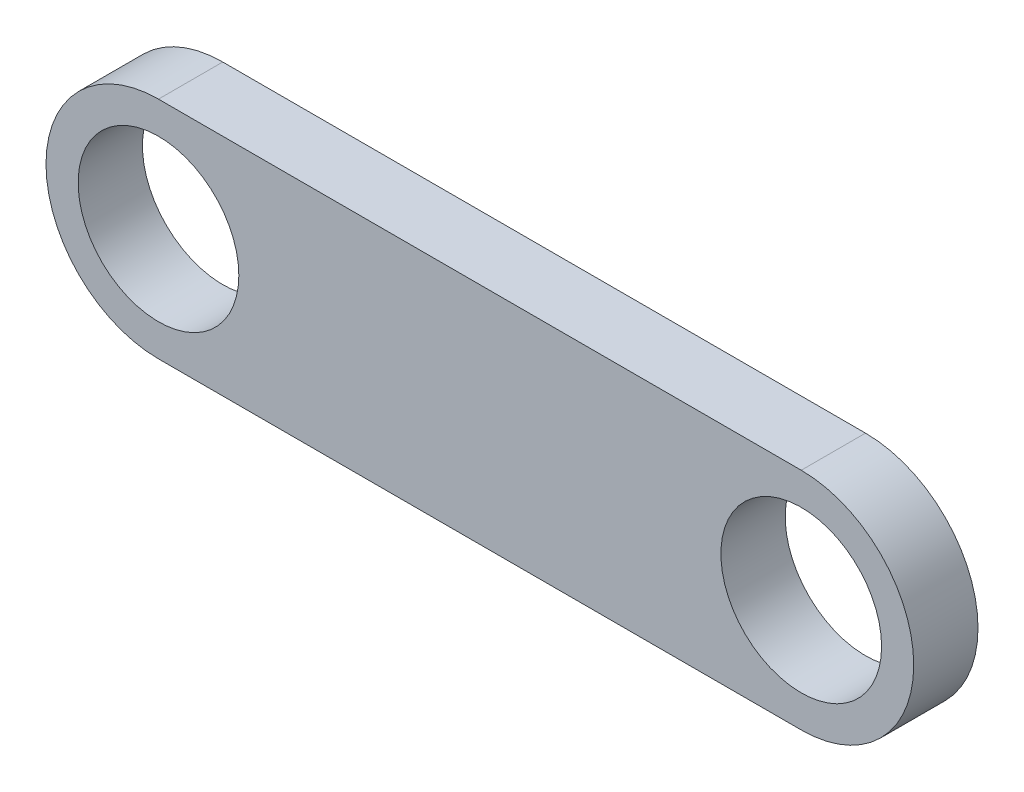
ISO-10303-21;
HEADER;
FILE_DESCRIPTION(('STEP AP214'),'2;1');
FILE_NAME('part.step','',(''),(''),'','','');
FILE_SCHEMA(('AUTOMOTIVE_DESIGN { 1 0 10303 214 1 1 1 1 }'));
ENDSEC;
DATA;
#1=APPLICATION_CONTEXT('core data for automotive mechanical design processes');
#2=APPLICATION_PROTOCOL_DEFINITION('international standard','automotive_design',2000,#1);
#3=PRODUCT_CONTEXT('',#1,'mechanical');
#4=PRODUCT('Part','Part','',(#3));
#5=PRODUCT_RELATED_PRODUCT_CATEGORY('part','',(#4));
#6=PRODUCT_DEFINITION_FORMATION('','',#4);
#7=PRODUCT_DEFINITION_CONTEXT('part definition',#1,'design');
#8=PRODUCT_DEFINITION('design','',#6,#7);
#9=PRODUCT_DEFINITION_SHAPE('','',#8);
#10=(LENGTH_UNIT() NAMED_UNIT(*) SI_UNIT(.MILLI.,.METRE.));
#11=(NAMED_UNIT(*) PLANE_ANGLE_UNIT() SI_UNIT($,.RADIAN.));
#12=(NAMED_UNIT(*) SI_UNIT($,.STERADIAN.) SOLID_ANGLE_UNIT());
#13=UNCERTAINTY_MEASURE_WITH_UNIT(LENGTH_MEASURE(1.E-05),#10,'distance_accuracy_value','');
#14=(GEOMETRIC_REPRESENTATION_CONTEXT(3) GLOBAL_UNCERTAINTY_ASSIGNED_CONTEXT((#13)) GLOBAL_UNIT_ASSIGNED_CONTEXT((#10,
#11,#12)) REPRESENTATION_CONTEXT('',''));
#15=CARTESIAN_POINT('',(0.,0.,0.));
#16=DIRECTION('',(0.,0.,1.));
#17=DIRECTION('',(1.,0.,0.));
#18=AXIS2_PLACEMENT_3D('',#15,#16,#17);
#19=CARTESIAN_POINT('',(0.,0.,19.9999999999999));
#20=DIRECTION('',(0.,0.,1.));
#21=DIRECTION('',(1.,0.,0.));
#22=AXIS2_PLACEMENT_3D('',#19,#20,#21);
#23=PLANE('',#22);
#24=CARTESIAN_POINT('',(0.,0.,19.9999999999999));
#25=DIRECTION('',(0.,0.,1.));
#26=DIRECTION('',(1.,0.,0.));
#27=AXIS2_PLACEMENT_3D('',#24,#25,#26);
#28=CIRCLE('',#27,25.);
#29=CARTESIAN_POINT('',(25.,0.,19.9999999999999));
#30=VERTEX_POINT('',#29);
#31=EDGE_CURVE('E101',#30,#30,#28,.T.);
#32=ORIENTED_EDGE('',*,*,#31,.F.);
#33=EDGE_LOOP('',(#32));
#34=FACE_BOUND('',#33,.T.);
#35=CARTESIAN_POINT('',(0.,0.,19.9999999999999));
#36=DIRECTION('',(0.,0.,1.));
#37=DIRECTION('',(1.,0.,0.));
#38=AXIS2_PLACEMENT_3D('',#35,#36,#37);
#39=CIRCLE('',#38,35.);
#40=CARTESIAN_POINT('',(0.,35.,19.9999999999999));
#41=VERTEX_POINT('',#40);
#42=CARTESIAN_POINT('',(0.,-35.,19.9999999999999));
#43=VERTEX_POINT('',#42);
#44=EDGE_CURVE('E86',#41,#43,#39,.T.);
#45=ORIENTED_EDGE('',*,*,#44,.T.);
#46=DIRECTION('',(1.,0.,0.));
#47=VECTOR('',#46,1.);
#48=CARTESIAN_POINT('',(0.,-35.,19.9999999999999));
#49=LINE('',#48,#47);
#50=CARTESIAN_POINT('',(200.,-35.,19.9999999999999));
#51=VERTEX_POINT('',#50);
#52=EDGE_CURVE('E81',#43,#51,#49,.T.);
#53=ORIENTED_EDGE('',*,*,#52,.T.);
#54=CARTESIAN_POINT('',(200.,0.,19.9999999999999));
#55=DIRECTION('',(0.,0.,1.));
#56=DIRECTION('',(1.,0.,0.));
#57=AXIS2_PLACEMENT_3D('',#54,#55,#56);
#58=CIRCLE('',#57,35.);
#59=CARTESIAN_POINT('',(200.,35.,19.9999999999999));
#60=VERTEX_POINT('',#59);
#61=EDGE_CURVE('E84',#51,#60,#58,.T.);
#62=ORIENTED_EDGE('',*,*,#61,.T.);
#63=DIRECTION('',(-1.,0.,0.));
#64=VECTOR('',#63,1.);
#65=CARTESIAN_POINT('',(0.,35.,19.9999999999999));
#66=LINE('',#65,#64);
#67=EDGE_CURVE('E51',#60,#41,#66,.T.);
#68=ORIENTED_EDGE('',*,*,#67,.T.);
#69=EDGE_LOOP('',(#45,#53,#62,#68));
#70=FACE_BOUND('',#69,.T.);
#71=CARTESIAN_POINT('',(200.,0.,19.9999999999999));
#72=DIRECTION('',(0.,0.,1.));
#73=DIRECTION('',(1.,0.,0.));
#74=AXIS2_PLACEMENT_3D('',#71,#72,#73);
#75=CIRCLE('',#74,25.);
#76=CARTESIAN_POINT('',(225.,0.,19.9999999999999));
#77=VERTEX_POINT('',#76);
#78=EDGE_CURVE('E116',#77,#77,#75,.T.);
#79=ORIENTED_EDGE('',*,*,#78,.F.);
#80=EDGE_LOOP('',(#79));
#81=FACE_BOUND('',#80,.T.);
#82=ADVANCED_FACE('F34',(#34,#70,#81),#23,.T.);
#83=CARTESIAN_POINT('',(0.,0.,0.));
#84=DIRECTION('',(0.,0.,1.));
#85=DIRECTION('',(1.,0.,0.));
#86=AXIS2_PLACEMENT_3D('',#83,#84,#85);
#87=PLANE('',#86);
#88=CARTESIAN_POINT('',(0.,0.,0.));
#89=DIRECTION('',(0.,0.,1.));
#90=DIRECTION('',(1.,0.,0.));
#91=AXIS2_PLACEMENT_3D('',#88,#89,#90);
#92=CIRCLE('',#91,35.);
#93=CARTESIAN_POINT('',(0.,35.,0.));
#94=VERTEX_POINT('',#93);
#95=CARTESIAN_POINT('',(0.,-35.,0.));
#96=VERTEX_POINT('',#95);
#97=EDGE_CURVE('E98',#94,#96,#92,.T.);
#98=ORIENTED_EDGE('',*,*,#97,.F.);
#99=DIRECTION('',(-1.,0.,0.));
#100=VECTOR('',#99,1.);
#101=CARTESIAN_POINT('',(0.,35.,0.));
#102=LINE('',#101,#100);
#103=CARTESIAN_POINT('',(200.,35.,0.));
#104=VERTEX_POINT('',#103);
#105=EDGE_CURVE('E74',#104,#94,#102,.T.);
#106=ORIENTED_EDGE('',*,*,#105,.F.);
#107=CARTESIAN_POINT('',(200.,0.,0.));
#108=DIRECTION('',(0.,0.,1.));
#109=DIRECTION('',(1.,0.,0.));
#110=AXIS2_PLACEMENT_3D('',#107,#108,#109);
#111=CIRCLE('',#110,35.);
#112=CARTESIAN_POINT('',(200.,-35.,0.));
#113=VERTEX_POINT('',#112);
#114=EDGE_CURVE('E68',#113,#104,#111,.T.);
#115=ORIENTED_EDGE('',*,*,#114,.F.);
#116=DIRECTION('',(1.,0.,0.));
#117=VECTOR('',#116,1.);
#118=CARTESIAN_POINT('',(0.,-35.,0.));
#119=LINE('',#118,#117);
#120=EDGE_CURVE('E90',#96,#113,#119,.T.);
#121=ORIENTED_EDGE('',*,*,#120,.F.);
#122=EDGE_LOOP('',(#98,#106,#115,#121));
#123=FACE_BOUND('',#122,.T.);
#124=CARTESIAN_POINT('',(0.,0.,0.));
#125=DIRECTION('',(0.,0.,1.));
#126=DIRECTION('',(1.,0.,0.));
#127=AXIS2_PLACEMENT_3D('',#124,#125,#126);
#128=CIRCLE('',#127,25.);
#129=CARTESIAN_POINT('',(25.,0.,0.));
#130=VERTEX_POINT('',#129);
#131=EDGE_CURVE('E113',#130,#130,#128,.T.);
#132=ORIENTED_EDGE('',*,*,#131,.T.);
#133=EDGE_LOOP('',(#132));
#134=FACE_BOUND('',#133,.T.);
#135=CARTESIAN_POINT('',(200.,0.,0.));
#136=DIRECTION('',(0.,0.,1.));
#137=DIRECTION('',(1.,0.,0.));
#138=AXIS2_PLACEMENT_3D('',#135,#136,#137);
#139=CIRCLE('',#138,25.);
#140=CARTESIAN_POINT('',(225.,0.,0.));
#141=VERTEX_POINT('',#140);
#142=EDGE_CURVE('E119',#141,#141,#139,.T.);
#143=ORIENTED_EDGE('',*,*,#142,.T.);
#144=EDGE_LOOP('',(#143));
#145=FACE_BOUND('',#144,.T.);
#146=ADVANCED_FACE('F109',(#123,#134,#145),#87,.F.);
#147=CARTESIAN_POINT('',(0.,0.,19.9999999999999));
#148=DIRECTION('',(0.,0.,-1.));
#149=DIRECTION('',(-1.,0.,0.));
#150=AXIS2_PLACEMENT_3D('',#147,#148,#149);
#151=CYLINDRICAL_SURFACE('',#150,35.);
#152=ORIENTED_EDGE('',*,*,#97,.T.);
#153=DIRECTION('',(0.,0.,-1.));
#154=VECTOR('',#153,1.);
#155=CARTESIAN_POINT('',(0.,-35.,19.9999999999999));
#156=LINE('',#155,#154);
#157=EDGE_CURVE('E11',#43,#96,#156,.T.);
#158=ORIENTED_EDGE('',*,*,#157,.F.);
#159=ORIENTED_EDGE('',*,*,#44,.F.);
#160=DIRECTION('',(0.,0.,-1.));
#161=VECTOR('',#160,1.);
#162=CARTESIAN_POINT('',(0.,35.,19.9999999999999));
#163=LINE('',#162,#161);
#164=EDGE_CURVE('E94',#41,#94,#163,.T.);
#165=ORIENTED_EDGE('',*,*,#164,.T.);
#166=EDGE_LOOP('',(#152,#158,#159,#165));
#167=FACE_BOUND('',#166,.T.);
#168=ADVANCED_FACE('F36',(#167),#151,.T.);
#169=CARTESIAN_POINT('',(0.,-35.,19.9999999999999));
#170=DIRECTION('',(0.,1.,0.));
#171=DIRECTION('',(0.,0.,1.));
#172=AXIS2_PLACEMENT_3D('',#169,#170,#171);
#173=PLANE('',#172);
#174=ORIENTED_EDGE('',*,*,#120,.T.);
#175=DIRECTION('',(0.,0.,-1.));
#176=VECTOR('',#175,1.);
#177=CARTESIAN_POINT('',(200.,-35.,19.9999999999999));
#178=LINE('',#177,#176);
#179=EDGE_CURVE('E43',#51,#113,#178,.T.);
#180=ORIENTED_EDGE('',*,*,#179,.F.);
#181=ORIENTED_EDGE('',*,*,#52,.F.);
#182=ORIENTED_EDGE('',*,*,#157,.T.);
#183=EDGE_LOOP('',(#174,#180,#181,#182));
#184=FACE_BOUND('',#183,.T.);
#185=ADVANCED_FACE('F89',(#184),#173,.F.);
#186=CARTESIAN_POINT('',(200.,0.,19.9999999999999));
#187=DIRECTION('',(0.,0.,-1.));
#188=DIRECTION('',(-1.,0.,0.));
#189=AXIS2_PLACEMENT_3D('',#186,#187,#188);
#190=CYLINDRICAL_SURFACE('',#189,35.);
#191=ORIENTED_EDGE('',*,*,#114,.T.);
#192=DIRECTION('',(0.,0.,-1.));
#193=VECTOR('',#192,1.);
#194=CARTESIAN_POINT('',(200.,35.,19.9999999999999));
#195=LINE('',#194,#193);
#196=EDGE_CURVE('E91',#60,#104,#195,.T.);
#197=ORIENTED_EDGE('',*,*,#196,.F.);
#198=ORIENTED_EDGE('',*,*,#61,.F.);
#199=ORIENTED_EDGE('',*,*,#179,.T.);
#200=EDGE_LOOP('',(#191,#197,#198,#199));
#201=FACE_BOUND('',#200,.T.);
#202=ADVANCED_FACE('F92',(#201),#190,.T.);
#203=CARTESIAN_POINT('',(0.,35.,19.9999999999999));
#204=DIRECTION('',(0.,-1.,0.));
#205=DIRECTION('',(0.,0.,-1.));
#206=AXIS2_PLACEMENT_3D('',#203,#204,#205);
#207=PLANE('',#206);
#208=ORIENTED_EDGE('',*,*,#105,.T.);
#209=ORIENTED_EDGE('',*,*,#164,.F.);
#210=ORIENTED_EDGE('',*,*,#67,.F.);
#211=ORIENTED_EDGE('',*,*,#196,.T.);
#212=EDGE_LOOP('',(#208,#209,#210,#211));
#213=FACE_BOUND('',#212,.T.);
#214=ADVANCED_FACE('F106',(#213),#207,.F.);
#215=CARTESIAN_POINT('',(0.,0.,19.9999999999999));
#216=DIRECTION('',(0.,0.,-1.));
#217=DIRECTION('',(-1.,0.,0.));
#218=AXIS2_PLACEMENT_3D('',#215,#216,#217);
#219=CYLINDRICAL_SURFACE('',#218,25.);
#220=ORIENTED_EDGE('',*,*,#31,.T.);
#221=EDGE_LOOP('',(#220));
#222=FACE_BOUND('',#221,.T.);
#223=ORIENTED_EDGE('',*,*,#131,.F.);
#224=EDGE_LOOP('',(#223));
#225=FACE_BOUND('',#224,.T.);
#226=ADVANCED_FACE('F136',(#222,#225),#219,.F.);
#227=CARTESIAN_POINT('',(200.,0.,19.9999999999999));
#228=DIRECTION('',(0.,0.,-1.));
#229=DIRECTION('',(-1.,0.,0.));
#230=AXIS2_PLACEMENT_3D('',#227,#228,#229);
#231=CYLINDRICAL_SURFACE('',#230,25.);
#232=ORIENTED_EDGE('',*,*,#78,.T.);
#233=EDGE_LOOP('',(#232));
#234=FACE_BOUND('',#233,.T.);
#235=ORIENTED_EDGE('',*,*,#142,.F.);
#236=EDGE_LOOP('',(#235));
#237=FACE_BOUND('',#236,.T.);
#238=ADVANCED_FACE('F125',(#234,#237),#231,.F.);
#239=CLOSED_SHELL('',(#82,#146,#168,#185,#202,#214,#226,#238));
#240=MANIFOLD_SOLID_BREP('B2',#239);
#241=ADVANCED_BREP_SHAPE_REPRESENTATION('',(#18,#240),#14);
#242=SHAPE_DEFINITION_REPRESENTATION(#9,#241);
ENDSEC;
END-ISO-10303-21;
